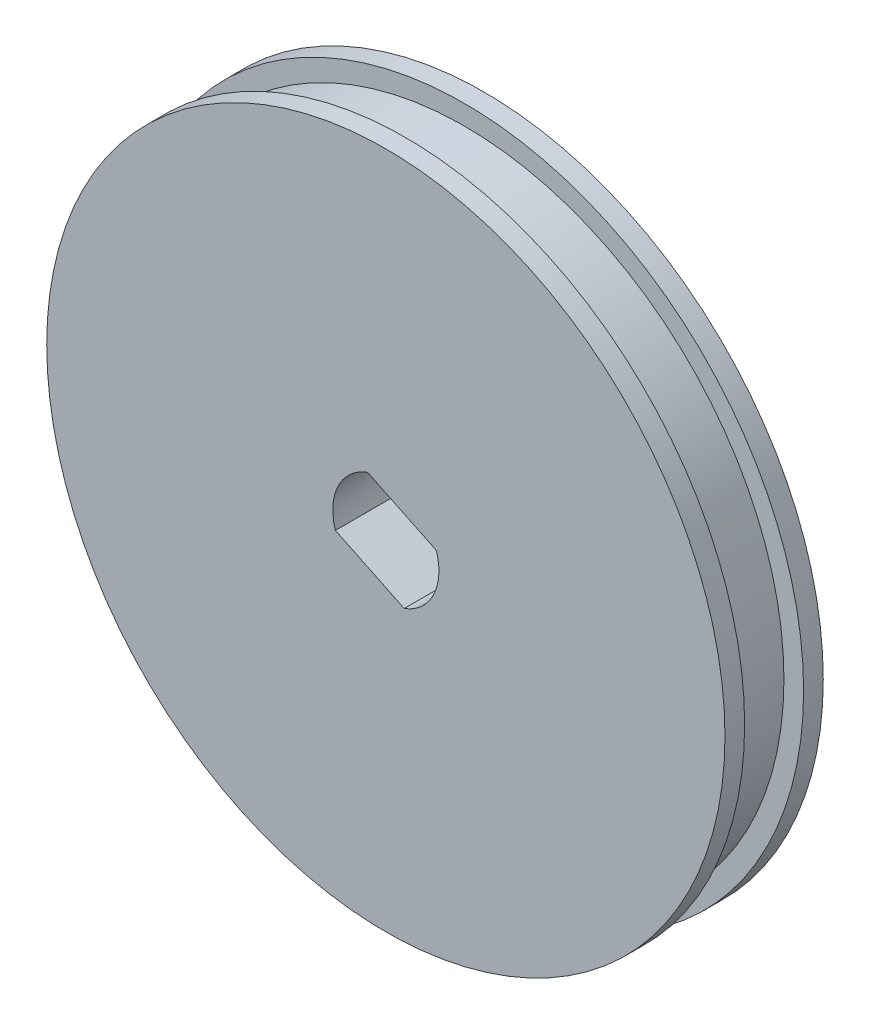
ISO-10303-21;
HEADER;
FILE_DESCRIPTION(('STEP AP214'),'2;1');
FILE_NAME('part.step','',(''),(''),'','','');
FILE_SCHEMA(('AUTOMOTIVE_DESIGN { 1 0 10303 214 1 1 1 1 }'));
ENDSEC;
DATA;
#1=APPLICATION_CONTEXT('core data for automotive mechanical design processes');
#2=APPLICATION_PROTOCOL_DEFINITION('international standard','automotive_design',2000,#1);
#3=PRODUCT_CONTEXT('',#1,'mechanical');
#4=PRODUCT('Part','Part','',(#3));
#5=PRODUCT_RELATED_PRODUCT_CATEGORY('part','',(#4));
#6=PRODUCT_DEFINITION_FORMATION('','',#4);
#7=PRODUCT_DEFINITION_CONTEXT('part definition',#1,'design');
#8=PRODUCT_DEFINITION('design','',#6,#7);
#9=PRODUCT_DEFINITION_SHAPE('','',#8);
#10=(LENGTH_UNIT() NAMED_UNIT(*) SI_UNIT(.MILLI.,.METRE.));
#11=(NAMED_UNIT(*) PLANE_ANGLE_UNIT() SI_UNIT($,.RADIAN.));
#12=(NAMED_UNIT(*) SI_UNIT($,.STERADIAN.) SOLID_ANGLE_UNIT());
#13=UNCERTAINTY_MEASURE_WITH_UNIT(LENGTH_MEASURE(1.E-05),#10,'distance_accuracy_value','');
#14=(GEOMETRIC_REPRESENTATION_CONTEXT(3) GLOBAL_UNCERTAINTY_ASSIGNED_CONTEXT((#13)) GLOBAL_UNIT_ASSIGNED_CONTEXT((#10,
#11,#12)) REPRESENTATION_CONTEXT('',''));
#15=CARTESIAN_POINT('',(0.,0.,0.));
#16=DIRECTION('',(0.,0.,1.));
#17=DIRECTION('',(1.,0.,0.));
#18=AXIS2_PLACEMENT_3D('',#15,#16,#17);
#19=CARTESIAN_POINT('',(22.4165324388438,-13.7076740487496,1.5));
#20=DIRECTION('',(0.,0.,-1.));
#21=DIRECTION('',(-1.,0.,0.));
#22=AXIS2_PLACEMENT_3D('',#19,#20,#21);
#23=CYLINDRICAL_SURFACE('',#22,16.25);
#24=CARTESIAN_POINT('',(22.4165324388438,-13.7076740487496,1.5));
#25=DIRECTION('',(0.,0.,1.));
#26=DIRECTION('',(1.,0.,0.));
#27=AXIS2_PLACEMENT_3D('',#24,#25,#26);
#28=CIRCLE('',#27,16.25);
#29=CARTESIAN_POINT('',(38.6665324388438,-13.7076740487496,1.5));
#30=VERTEX_POINT('',#29);
#31=EDGE_CURVE('E11',#30,#30,#28,.T.);
#32=ORIENTED_EDGE('',*,*,#31,.F.);
#33=EDGE_LOOP('',(#32));
#34=FACE_BOUND('',#33,.T.);
#35=CARTESIAN_POINT('',(22.4165324388438,-13.7076740487496,-1.5));
#36=DIRECTION('',(0.,0.,1.));
#37=DIRECTION('',(1.,0.,0.));
#38=AXIS2_PLACEMENT_3D('',#35,#36,#37);
#39=CIRCLE('',#38,16.25);
#40=CARTESIAN_POINT('',(38.6665324388438,-13.7076740487496,-1.5));
#41=VERTEX_POINT('',#40);
#42=EDGE_CURVE('E48',#41,#41,#39,.T.);
#43=ORIENTED_EDGE('',*,*,#42,.T.);
#44=EDGE_LOOP('',(#43));
#45=FACE_BOUND('',#44,.T.);
#46=ADVANCED_FACE('F45',(#34,#45),#23,.T.);
#47=CARTESIAN_POINT('',(22.4165324388438,-13.7076740487496,2.5));
#48=DIRECTION('',(0.,0.,-1.));
#49=DIRECTION('',(-1.,0.,0.));
#50=AXIS2_PLACEMENT_3D('',#47,#48,#49);
#51=CYLINDRICAL_SURFACE('',#50,17.25);
#52=CARTESIAN_POINT('',(22.4165324388438,-13.7076740487496,2.5));
#53=DIRECTION('',(0.,0.,1.));
#54=DIRECTION('',(1.,0.,0.));
#55=AXIS2_PLACEMENT_3D('',#52,#53,#54);
#56=CIRCLE('',#55,17.25);
#57=CARTESIAN_POINT('',(39.6665324388438,-13.7076740487496,2.5));
#58=VERTEX_POINT('',#57);
#59=EDGE_CURVE('E54',#58,#58,#56,.T.);
#60=ORIENTED_EDGE('',*,*,#59,.F.);
#61=EDGE_LOOP('',(#60));
#62=FACE_BOUND('',#61,.T.);
#63=CARTESIAN_POINT('',(22.4165324388438,-13.7076740487496,1.5));
#64=DIRECTION('',(0.,0.,1.));
#65=DIRECTION('',(1.,0.,0.));
#66=AXIS2_PLACEMENT_3D('',#63,#64,#65);
#67=CIRCLE('',#66,17.25);
#68=CARTESIAN_POINT('',(39.6665324388438,-13.7076740487496,1.5));
#69=VERTEX_POINT('',#68);
#70=EDGE_CURVE('E146',#69,#69,#67,.T.);
#71=ORIENTED_EDGE('',*,*,#70,.T.);
#72=EDGE_LOOP('',(#71));
#73=FACE_BOUND('',#72,.T.);
#74=ADVANCED_FACE('F177',(#62,#73),#51,.T.);
#75=CARTESIAN_POINT('',(22.4165324388438,-13.7076740487496,2.5));
#76=DIRECTION('',(0.,0.,1.));
#77=DIRECTION('',(1.,0.,0.));
#78=AXIS2_PLACEMENT_3D('',#75,#76,#77);
#79=PLANE('',#78);
#80=CARTESIAN_POINT('',(22.4165324388438,-13.7076740487496,2.5));
#81=DIRECTION('',(0.,0.,1.));
#82=DIRECTION('',(1.,0.,0.));
#83=AXIS2_PLACEMENT_3D('',#80,#81,#82);
#84=CIRCLE('',#83,2.7);
#85=CARTESIAN_POINT('',(23.3491856746077,-16.2414771077538,2.5));
#86=VERTEX_POINT('',#85);
#87=CARTESIAN_POINT('',(24.9818423701452,-12.8655428497273,2.5));
#88=VERTEX_POINT('',#87);
#89=EDGE_CURVE('E61',#86,#88,#84,.T.);
#90=ORIENTED_EDGE('',*,*,#89,.F.);
#91=DIRECTION('',(0.900249135473721,-0.435375118809995,0.));
#92=VECTOR('',#91,1.);
#93=CARTESIAN_POINT('',(19.8512225075425,-14.5498052477718,2.5));
#94=LINE('',#93,#92);
#95=CARTESIAN_POINT('',(19.8512225075425,-14.5498052477718,2.5));
#96=VERTEX_POINT('',#95);
#97=EDGE_CURVE('E108',#96,#86,#94,.T.);
#98=ORIENTED_EDGE('',*,*,#97,.F.);
#99=CARTESIAN_POINT('',(22.4165324388438,-13.7076740487496,2.5));
#100=DIRECTION('',(0.,0.,1.));
#101=DIRECTION('',(1.,0.,0.));
#102=AXIS2_PLACEMENT_3D('',#99,#100,#101);
#103=CIRCLE('',#102,2.70000000000001);
#104=CARTESIAN_POINT('',(21.4838792030799,-11.1738709897453,2.5));
#105=VERTEX_POINT('',#104);
#106=EDGE_CURVE('E112',#105,#96,#103,.T.);
#107=ORIENTED_EDGE('',*,*,#106,.F.);
#108=DIRECTION('',(-0.900249135473721,0.435375118809995,0.));
#109=VECTOR('',#108,1.);
#110=CARTESIAN_POINT('',(24.9818423701452,-12.8655428497273,2.5));
#111=LINE('',#110,#109);
#112=EDGE_CURVE('E121',#88,#105,#111,.T.);
#113=ORIENTED_EDGE('',*,*,#112,.F.);
#114=EDGE_LOOP('',(#90,#98,#107,#113));
#115=FACE_BOUND('',#114,.T.);
#116=ORIENTED_EDGE('',*,*,#59,.T.);
#117=EDGE_LOOP('',(#116));
#118=FACE_BOUND('',#117,.T.);
#119=ADVANCED_FACE('F172',(#115,#118),#79,.T.);
#120=CARTESIAN_POINT('',(22.4165324388438,-13.7076740487496,1.5));
#121=DIRECTION('',(0.,0.,1.));
#122=DIRECTION('',(1.,0.,0.));
#123=AXIS2_PLACEMENT_3D('',#120,#121,#122);
#124=PLANE('',#123);
#125=ORIENTED_EDGE('',*,*,#31,.T.);
#126=EDGE_LOOP('',(#125));
#127=FACE_BOUND('',#126,.T.);
#128=ORIENTED_EDGE('',*,*,#70,.F.);
#129=EDGE_LOOP('',(#128));
#130=FACE_BOUND('',#129,.T.);
#131=ADVANCED_FACE('F164',(#127,#130),#124,.F.);
#132=CARTESIAN_POINT('',(22.4165324388438,-13.7076740487496,-2.5));
#133=DIRECTION('',(0.,0.,1.));
#134=DIRECTION('',(1.,0.,0.));
#135=AXIS2_PLACEMENT_3D('',#132,#133,#134);
#136=CYLINDRICAL_SURFACE('',#135,17.25);
#137=CARTESIAN_POINT('',(22.4165324388438,-13.7076740487496,-2.5));
#138=DIRECTION('',(0.,0.,1.));
#139=DIRECTION('',(1.,0.,0.));
#140=AXIS2_PLACEMENT_3D('',#137,#138,#139);
#141=CIRCLE('',#140,17.25);
#142=CARTESIAN_POINT('',(39.6665324388438,-13.7076740487496,-2.5));
#143=VERTEX_POINT('',#142);
#144=EDGE_CURVE('E136',#143,#143,#141,.T.);
#145=ORIENTED_EDGE('',*,*,#144,.T.);
#146=EDGE_LOOP('',(#145));
#147=FACE_BOUND('',#146,.T.);
#148=CARTESIAN_POINT('',(22.4165324388438,-13.7076740487496,-1.5));
#149=DIRECTION('',(0.,0.,1.));
#150=DIRECTION('',(1.,0.,0.));
#151=AXIS2_PLACEMENT_3D('',#148,#149,#150);
#152=CIRCLE('',#151,17.25);
#153=CARTESIAN_POINT('',(39.6665324388438,-13.7076740487496,-1.5));
#154=VERTEX_POINT('',#153);
#155=EDGE_CURVE('E130',#154,#154,#152,.T.);
#156=ORIENTED_EDGE('',*,*,#155,.F.);
#157=EDGE_LOOP('',(#156));
#158=FACE_BOUND('',#157,.T.);
#159=ADVANCED_FACE('F162',(#147,#158),#136,.T.);
#160=CARTESIAN_POINT('',(22.4165324388438,-13.7076740487496,-2.5));
#161=DIRECTION('',(0.,0.,-1.));
#162=DIRECTION('',(1.,0.,0.));
#163=AXIS2_PLACEMENT_3D('',#160,#161,#162);
#164=PLANE('',#163);
#165=CARTESIAN_POINT('',(22.4165324388438,-13.7076740487496,-2.5));
#166=DIRECTION('',(0.,0.,1.));
#167=DIRECTION('',(1.,0.,0.));
#168=AXIS2_PLACEMENT_3D('',#165,#166,#167);
#169=CIRCLE('',#168,2.7);
#170=CARTESIAN_POINT('',(23.3491856746077,-16.2414771077538,-2.5));
#171=VERTEX_POINT('',#170);
#172=CARTESIAN_POINT('',(24.9818423701452,-12.8655428497273,-2.5));
#173=VERTEX_POINT('',#172);
#174=EDGE_CURVE('E89',#171,#173,#169,.T.);
#175=ORIENTED_EDGE('',*,*,#174,.T.);
#176=DIRECTION('',(-0.900249135473721,0.435375118809995,0.));
#177=VECTOR('',#176,1.);
#178=CARTESIAN_POINT('',(24.9818423701452,-12.8655428497273,-2.5));
#179=LINE('',#178,#177);
#180=CARTESIAN_POINT('',(21.4838792030799,-11.1738709897453,-2.5));
#181=VERTEX_POINT('',#180);
#182=EDGE_CURVE('E99',#173,#181,#179,.T.);
#183=ORIENTED_EDGE('',*,*,#182,.T.);
#184=CARTESIAN_POINT('',(22.4165324388438,-13.7076740487496,-2.5));
#185=DIRECTION('',(0.,0.,1.));
#186=DIRECTION('',(1.,0.,0.));
#187=AXIS2_PLACEMENT_3D('',#184,#185,#186);
#188=CIRCLE('',#187,2.70000000000001);
#189=CARTESIAN_POINT('',(19.8512225075425,-14.5498052477718,-2.5));
#190=VERTEX_POINT('',#189);
#191=EDGE_CURVE('E69',#181,#190,#188,.T.);
#192=ORIENTED_EDGE('',*,*,#191,.T.);
#193=DIRECTION('',(0.900249135473721,-0.435375118809995,0.));
#194=VECTOR('',#193,1.);
#195=CARTESIAN_POINT('',(19.8512225075425,-14.5498052477718,-2.5));
#196=LINE('',#195,#194);
#197=EDGE_CURVE('E96',#190,#171,#196,.T.);
#198=ORIENTED_EDGE('',*,*,#197,.T.);
#199=EDGE_LOOP('',(#175,#183,#192,#198));
#200=FACE_BOUND('',#199,.T.);
#201=ORIENTED_EDGE('',*,*,#144,.F.);
#202=EDGE_LOOP('',(#201));
#203=FACE_BOUND('',#202,.T.);
#204=ADVANCED_FACE('F104',(#200,#203),#164,.T.);
#205=CARTESIAN_POINT('',(22.4165324388438,-13.7076740487496,-1.5));
#206=DIRECTION('',(0.,0.,-1.));
#207=DIRECTION('',(1.,0.,0.));
#208=AXIS2_PLACEMENT_3D('',#205,#206,#207);
#209=PLANE('',#208);
#210=ORIENTED_EDGE('',*,*,#42,.F.);
#211=EDGE_LOOP('',(#210));
#212=FACE_BOUND('',#211,.T.);
#213=ORIENTED_EDGE('',*,*,#155,.T.);
#214=EDGE_LOOP('',(#213));
#215=FACE_BOUND('',#214,.T.);
#216=ADVANCED_FACE('F156',(#212,#215),#209,.F.);
#217=CARTESIAN_POINT('',(22.4165324388438,-13.7076740487496,-2.5));
#218=DIRECTION('',(0.,0.,1.));
#219=DIRECTION('',(1.,0.,0.));
#220=AXIS2_PLACEMENT_3D('',#217,#218,#219);
#221=CYLINDRICAL_SURFACE('',#220,2.7);
#222=ORIENTED_EDGE('',*,*,#89,.T.);
#223=DIRECTION('',(0.,0.,1.));
#224=VECTOR('',#223,1.);
#225=CARTESIAN_POINT('',(24.9818423701452,-12.8655428497273,-2.5));
#226=LINE('',#225,#224);
#227=EDGE_CURVE('E85',#173,#88,#226,.T.);
#228=ORIENTED_EDGE('',*,*,#227,.F.);
#229=ORIENTED_EDGE('',*,*,#174,.F.);
#230=DIRECTION('',(0.,0.,1.));
#231=VECTOR('',#230,1.);
#232=CARTESIAN_POINT('',(23.3491856746077,-16.2414771077538,-2.5));
#233=LINE('',#232,#231);
#234=EDGE_CURVE('E127',#171,#86,#233,.T.);
#235=ORIENTED_EDGE('',*,*,#234,.T.);
#236=EDGE_LOOP('',(#222,#228,#229,#235));
#237=FACE_BOUND('',#236,.T.);
#238=ADVANCED_FACE('F87',(#237),#221,.F.);
#239=CARTESIAN_POINT('',(19.8512225075425,-14.5498052477718,-2.5));
#240=DIRECTION('',(-0.435375118809995,-0.900249135473721,0.));
#241=DIRECTION('',(0.900249135473721,-0.435375118809996,0.));
#242=AXIS2_PLACEMENT_3D('',#239,#240,#241);
#243=PLANE('',#242);
#244=ORIENTED_EDGE('',*,*,#97,.T.);
#245=ORIENTED_EDGE('',*,*,#234,.F.);
#246=ORIENTED_EDGE('',*,*,#197,.F.);
#247=DIRECTION('',(0.,0.,1.));
#248=VECTOR('',#247,1.);
#249=CARTESIAN_POINT('',(19.8512225075425,-14.5498052477718,-2.5));
#250=LINE('',#249,#248);
#251=EDGE_CURVE('E131',#190,#96,#250,.T.);
#252=ORIENTED_EDGE('',*,*,#251,.T.);
#253=EDGE_LOOP('',(#244,#245,#246,#252));
#254=FACE_BOUND('',#253,.T.);
#255=ADVANCED_FACE('F197',(#254),#243,.F.);
#256=CARTESIAN_POINT('',(22.4165324388438,-13.7076740487496,-2.5));
#257=DIRECTION('',(0.,0.,1.));
#258=DIRECTION('',(1.,0.,0.));
#259=AXIS2_PLACEMENT_3D('',#256,#257,#258);
#260=CYLINDRICAL_SURFACE('',#259,2.70000000000001);
#261=ORIENTED_EDGE('',*,*,#106,.T.);
#262=ORIENTED_EDGE('',*,*,#251,.F.);
#263=ORIENTED_EDGE('',*,*,#191,.F.);
#264=DIRECTION('',(0.,0.,1.));
#265=VECTOR('',#264,1.);
#266=CARTESIAN_POINT('',(21.4838792030799,-11.1738709897453,-2.5));
#267=LINE('',#266,#265);
#268=EDGE_CURVE('E95',#181,#105,#267,.T.);
#269=ORIENTED_EDGE('',*,*,#268,.T.);
#270=EDGE_LOOP('',(#261,#262,#263,#269));
#271=FACE_BOUND('',#270,.T.);
#272=ADVANCED_FACE('F195',(#271),#260,.F.);
#273=CARTESIAN_POINT('',(24.9818423701452,-12.8655428497273,-2.5));
#274=DIRECTION('',(0.435375118809995,0.900249135473721,0.));
#275=DIRECTION('',(-0.900249135473721,0.435375118809995,0.));
#276=AXIS2_PLACEMENT_3D('',#273,#274,#275);
#277=PLANE('',#276);
#278=ORIENTED_EDGE('',*,*,#112,.T.);
#279=ORIENTED_EDGE('',*,*,#268,.F.);
#280=ORIENTED_EDGE('',*,*,#182,.F.);
#281=ORIENTED_EDGE('',*,*,#227,.T.);
#282=EDGE_LOOP('',(#278,#279,#280,#281));
#283=FACE_BOUND('',#282,.T.);
#284=ADVANCED_FACE('F100',(#283),#277,.F.);
#285=CLOSED_SHELL('',(#46,#74,#119,#131,#159,#204,#216,#238,#255,#272,#284));
#286=MANIFOLD_SOLID_BREP('B2',#285);
#287=ADVANCED_BREP_SHAPE_REPRESENTATION('',(#18,#286),#14);
#288=SHAPE_DEFINITION_REPRESENTATION(#9,#287);
ENDSEC;
END-ISO-10303-21;
